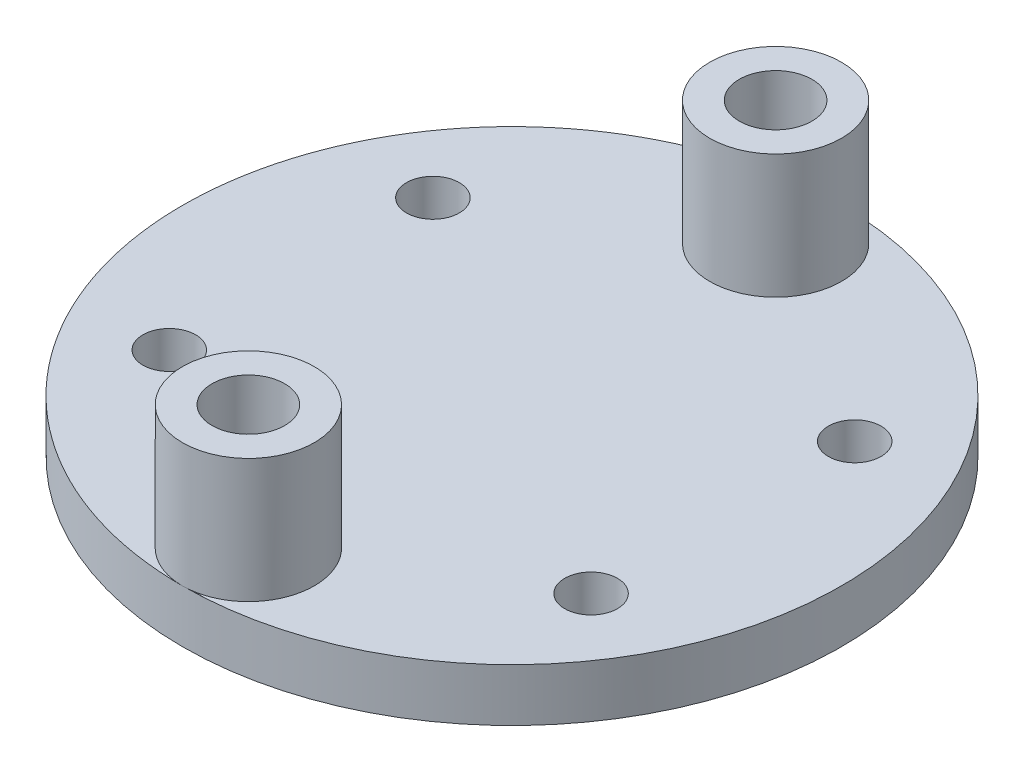
ISO-10303-21;
HEADER;
FILE_DESCRIPTION(('STEP AP214'),'2;1');
FILE_NAME('part.step','',(''),(''),'','','');
FILE_SCHEMA(('AUTOMOTIVE_DESIGN { 1 0 10303 214 1 1 1 1 }'));
ENDSEC;
DATA;
#1=APPLICATION_CONTEXT('core data for automotive mechanical design processes');
#2=APPLICATION_PROTOCOL_DEFINITION('international standard','automotive_design',2000,#1);
#3=PRODUCT_CONTEXT('',#1,'mechanical');
#4=PRODUCT('Part','Part','',(#3));
#5=PRODUCT_RELATED_PRODUCT_CATEGORY('part','',(#4));
#6=PRODUCT_DEFINITION_FORMATION('','',#4);
#7=PRODUCT_DEFINITION_CONTEXT('part definition',#1,'design');
#8=PRODUCT_DEFINITION('design','',#6,#7);
#9=PRODUCT_DEFINITION_SHAPE('','',#8);
#10=(LENGTH_UNIT() NAMED_UNIT(*) SI_UNIT(.MILLI.,.METRE.));
#11=(NAMED_UNIT(*) PLANE_ANGLE_UNIT() SI_UNIT($,.RADIAN.));
#12=(NAMED_UNIT(*) SI_UNIT($,.STERADIAN.) SOLID_ANGLE_UNIT());
#13=UNCERTAINTY_MEASURE_WITH_UNIT(LENGTH_MEASURE(1.E-05),#10,'distance_accuracy_value','');
#14=(GEOMETRIC_REPRESENTATION_CONTEXT(3) GLOBAL_UNCERTAINTY_ASSIGNED_CONTEXT((#13)) GLOBAL_UNIT_ASSIGNED_CONTEXT((#10,
#11,#12)) REPRESENTATION_CONTEXT('',''));
#15=CARTESIAN_POINT('',(0.,0.,0.));
#16=DIRECTION('',(0.,0.,1.));
#17=DIRECTION('',(1.,0.,0.));
#18=AXIS2_PLACEMENT_3D('',#15,#16,#17);
#19=CARTESIAN_POINT('',(12.7,2.54,-21.59));
#20=DIRECTION('',(0.,-1.,0.));
#21=DIRECTION('',(0.,0.,-1.));
#22=AXIS2_PLACEMENT_3D('',#19,#20,#21);
#23=CYLINDRICAL_SURFACE('',#22,1.75);
#24=CARTESIAN_POINT('',(12.7,0.,-21.59));
#25=DIRECTION('',(0.,1.,0.));
#26=DIRECTION('',(0.,0.,1.));
#27=AXIS2_PLACEMENT_3D('',#24,#25,#26);
#28=CIRCLE('',#27,1.75);
#29=CARTESIAN_POINT('',(12.7,0.,-19.84));
#30=VERTEX_POINT('',#29);
#31=EDGE_CURVE('E93',#30,#30,#28,.T.);
#32=ORIENTED_EDGE('',*,*,#31,.F.);
#33=EDGE_LOOP('',(#32));
#34=FACE_BOUND('',#33,.T.);
#35=CARTESIAN_POINT('',(12.7,8.514999988,-21.59));
#36=DIRECTION('',(0.,1.,0.));
#37=DIRECTION('',(0.,0.,1.));
#38=AXIS2_PLACEMENT_3D('',#35,#36,#37);
#39=CIRCLE('',#38,1.75);
#40=CARTESIAN_POINT('',(12.7,8.514999988,-19.84));
#41=VERTEX_POINT('',#40);
#42=EDGE_CURVE('E189',#41,#41,#39,.F.);
#43=ORIENTED_EDGE('',*,*,#42,.F.);
#44=EDGE_LOOP('',(#43));
#45=FACE_BOUND('',#44,.T.);
#46=ADVANCED_FACE('F42',(#34,#45),#23,.F.);
#47=CARTESIAN_POINT('',(12.7,2.54,-8.89));
#48=DIRECTION('',(0.,-1.,0.));
#49=DIRECTION('',(0.,0.,-1.));
#50=AXIS2_PLACEMENT_3D('',#47,#48,#49);
#51=CYLINDRICAL_SURFACE('',#50,15.875);
#52=CARTESIAN_POINT('',(12.7,2.54,-8.89));
#53=DIRECTION('',(0.,1.,0.));
#54=DIRECTION('',(0.,0.,1.));
#55=AXIS2_PLACEMENT_3D('',#52,#53,#54);
#56=CIRCLE('',#55,15.875);
#57=CARTESIAN_POINT('',(12.7,2.54,6.985));
#58=VERTEX_POINT('',#57);
#59=CARTESIAN_POINT('',(12.7,2.54,-24.765));
#60=VERTEX_POINT('',#59);
#61=EDGE_CURVE('E11',#58,#60,#56,.T.);
#62=ORIENTED_EDGE('',*,*,#61,.F.);
#63=EDGE_CURVE('E52',#60,#58,#56,.T.);
#64=ORIENTED_EDGE('',*,*,#63,.F.);
#65=EDGE_LOOP('',(#62,#64));
#66=FACE_BOUND('',#65,.T.);
#67=CARTESIAN_POINT('',(12.7,0.,-8.89));
#68=DIRECTION('',(0.,1.,0.));
#69=DIRECTION('',(0.,0.,1.));
#70=AXIS2_PLACEMENT_3D('',#67,#68,#69);
#71=CIRCLE('',#70,15.875);
#72=CARTESIAN_POINT('',(12.7,0.,6.985));
#73=VERTEX_POINT('',#72);
#74=EDGE_CURVE('E90',#73,#73,#71,.T.);
#75=ORIENTED_EDGE('',*,*,#74,.T.);
#76=EDGE_LOOP('',(#75));
#77=FACE_BOUND('',#76,.T.);
#78=ADVANCED_FACE('F62',(#66,#77),#51,.T.);
#79=CARTESIAN_POINT('',(2.54,2.54,-2.54));
#80=DIRECTION('',(0.,-1.,0.));
#81=DIRECTION('',(0.,0.,-1.));
#82=AXIS2_PLACEMENT_3D('',#79,#80,#81);
#83=CYLINDRICAL_SURFACE('',#82,1.27);
#84=CARTESIAN_POINT('',(2.54,2.54,-2.54));
#85=DIRECTION('',(0.,1.,0.));
#86=DIRECTION('',(0.,0.,1.));
#87=AXIS2_PLACEMENT_3D('',#84,#85,#86);
#88=CIRCLE('',#87,1.27);
#89=CARTESIAN_POINT('',(2.54,2.54,-1.27));
#90=VERTEX_POINT('',#89);
#91=EDGE_CURVE('E69',#90,#90,#88,.F.);
#92=ORIENTED_EDGE('',*,*,#91,.F.);
#93=EDGE_LOOP('',(#92));
#94=FACE_BOUND('',#93,.T.);
#95=CARTESIAN_POINT('',(2.54,0.,-2.54));
#96=DIRECTION('',(0.,1.,0.));
#97=DIRECTION('',(0.,0.,1.));
#98=AXIS2_PLACEMENT_3D('',#95,#96,#97);
#99=CIRCLE('',#98,1.27);
#100=CARTESIAN_POINT('',(2.54,0.,-1.27));
#101=VERTEX_POINT('',#100);
#102=EDGE_CURVE('E88',#101,#101,#99,.F.);
#103=ORIENTED_EDGE('',*,*,#102,.T.);
#104=EDGE_LOOP('',(#103));
#105=FACE_BOUND('',#104,.T.);
#106=ADVANCED_FACE('F121',(#94,#105),#83,.F.);
#107=CARTESIAN_POINT('',(22.86,2.54,-2.54));
#108=DIRECTION('',(0.,-1.,0.));
#109=DIRECTION('',(0.,0.,-1.));
#110=AXIS2_PLACEMENT_3D('',#107,#108,#109);
#111=CYLINDRICAL_SURFACE('',#110,1.27);
#112=CARTESIAN_POINT('',(22.86,2.54,-2.54));
#113=DIRECTION('',(0.,1.,0.));
#114=DIRECTION('',(0.,0.,1.));
#115=AXIS2_PLACEMENT_3D('',#112,#113,#114);
#116=CIRCLE('',#115,1.27);
#117=CARTESIAN_POINT('',(22.86,2.54,-1.27));
#118=VERTEX_POINT('',#117);
#119=EDGE_CURVE('E75',#118,#118,#116,.T.);
#120=ORIENTED_EDGE('',*,*,#119,.T.);
#121=EDGE_LOOP('',(#120));
#122=FACE_BOUND('',#121,.T.);
#123=CARTESIAN_POINT('',(22.86,0.,-2.54));
#124=DIRECTION('',(0.,1.,0.));
#125=DIRECTION('',(0.,0.,1.));
#126=AXIS2_PLACEMENT_3D('',#123,#124,#125);
#127=CIRCLE('',#126,1.27);
#128=CARTESIAN_POINT('',(22.86,0.,-1.27));
#129=VERTEX_POINT('',#128);
#130=EDGE_CURVE('E83',#129,#129,#127,.T.);
#131=ORIENTED_EDGE('',*,*,#130,.F.);
#132=EDGE_LOOP('',(#131));
#133=FACE_BOUND('',#132,.T.);
#134=ADVANCED_FACE('F112',(#122,#133),#111,.F.);
#135=CARTESIAN_POINT('',(2.54,2.54,-15.24));
#136=DIRECTION('',(0.,-1.,0.));
#137=DIRECTION('',(0.,0.,-1.));
#138=AXIS2_PLACEMENT_3D('',#135,#136,#137);
#139=CYLINDRICAL_SURFACE('',#138,1.27);
#140=CARTESIAN_POINT('',(2.54,2.54,-15.24));
#141=DIRECTION('',(0.,1.,0.));
#142=DIRECTION('',(0.,0.,1.));
#143=AXIS2_PLACEMENT_3D('',#140,#141,#142);
#144=CIRCLE('',#143,1.27);
#145=CARTESIAN_POINT('',(2.54,2.54,-13.97));
#146=VERTEX_POINT('',#145);
#147=EDGE_CURVE('E99',#146,#146,#144,.T.);
#148=ORIENTED_EDGE('',*,*,#147,.T.);
#149=EDGE_LOOP('',(#148));
#150=FACE_BOUND('',#149,.T.);
#151=CARTESIAN_POINT('',(2.54,0.,-15.24));
#152=DIRECTION('',(0.,1.,0.));
#153=DIRECTION('',(0.,0.,1.));
#154=AXIS2_PLACEMENT_3D('',#151,#152,#153);
#155=CIRCLE('',#154,1.27);
#156=CARTESIAN_POINT('',(2.54,0.,-13.97));
#157=VERTEX_POINT('',#156);
#158=EDGE_CURVE('E78',#157,#157,#155,.T.);
#159=ORIENTED_EDGE('',*,*,#158,.F.);
#160=EDGE_LOOP('',(#159));
#161=FACE_BOUND('',#160,.T.);
#162=ADVANCED_FACE('F144',(#150,#161),#139,.F.);
#163=CARTESIAN_POINT('',(22.86,2.54,-15.24));
#164=DIRECTION('',(0.,-1.,0.));
#165=DIRECTION('',(0.,0.,-1.));
#166=AXIS2_PLACEMENT_3D('',#163,#164,#165);
#167=CYLINDRICAL_SURFACE('',#166,1.27);
#168=CARTESIAN_POINT('',(22.86,2.54,-15.24));
#169=DIRECTION('',(0.,1.,0.));
#170=DIRECTION('',(0.,0.,1.));
#171=AXIS2_PLACEMENT_3D('',#168,#169,#170);
#172=CIRCLE('',#171,1.27);
#173=CARTESIAN_POINT('',(22.86,2.54,-13.97));
#174=VERTEX_POINT('',#173);
#175=EDGE_CURVE('E96',#174,#174,#172,.F.);
#176=ORIENTED_EDGE('',*,*,#175,.F.);
#177=EDGE_LOOP('',(#176));
#178=FACE_BOUND('',#177,.T.);
#179=CARTESIAN_POINT('',(22.86,0.,-15.24));
#180=DIRECTION('',(0.,1.,0.));
#181=DIRECTION('',(0.,0.,1.));
#182=AXIS2_PLACEMENT_3D('',#179,#180,#181);
#183=CIRCLE('',#182,1.27);
#184=CARTESIAN_POINT('',(22.86,0.,-13.97));
#185=VERTEX_POINT('',#184);
#186=EDGE_CURVE('E79',#185,#185,#183,.F.);
#187=ORIENTED_EDGE('',*,*,#186,.T.);
#188=EDGE_LOOP('',(#187));
#189=FACE_BOUND('',#188,.T.);
#190=ADVANCED_FACE('F46',(#178,#189),#167,.F.);
#191=CARTESIAN_POINT('',(12.7,2.54,3.81));
#192=DIRECTION('',(0.,-1.,0.));
#193=DIRECTION('',(0.,0.,-1.));
#194=AXIS2_PLACEMENT_3D('',#191,#192,#193);
#195=CYLINDRICAL_SURFACE('',#194,1.75);
#196=CARTESIAN_POINT('',(12.7,0.,3.81));
#197=DIRECTION('',(0.,1.,0.));
#198=DIRECTION('',(0.,0.,1.));
#199=AXIS2_PLACEMENT_3D('',#196,#197,#198);
#200=CIRCLE('',#199,1.75);
#201=CARTESIAN_POINT('',(12.7,0.,5.56));
#202=VERTEX_POINT('',#201);
#203=EDGE_CURVE('E48',#202,#202,#200,.F.);
#204=ORIENTED_EDGE('',*,*,#203,.T.);
#205=EDGE_LOOP('',(#204));
#206=FACE_BOUND('',#205,.T.);
#207=CARTESIAN_POINT('',(12.7,8.514999988,3.81));
#208=DIRECTION('',(0.,1.,0.));
#209=DIRECTION('',(0.,0.,1.));
#210=AXIS2_PLACEMENT_3D('',#207,#208,#209);
#211=CIRCLE('',#210,1.75);
#212=CARTESIAN_POINT('',(12.7,8.514999988,5.56));
#213=VERTEX_POINT('',#212);
#214=EDGE_CURVE('E194',#213,#213,#211,.F.);
#215=ORIENTED_EDGE('',*,*,#214,.F.);
#216=EDGE_LOOP('',(#215));
#217=FACE_BOUND('',#216,.T.);
#218=ADVANCED_FACE('F120',(#206,#217),#195,.F.);
#219=CARTESIAN_POINT('',(0.,2.54,0.));
#220=DIRECTION('',(0.,1.,0.));
#221=DIRECTION('',(0.,0.,1.));
#222=AXIS2_PLACEMENT_3D('',#219,#220,#221);
#223=PLANE('',#222);
#224=ORIENTED_EDGE('',*,*,#175,.T.);
#225=EDGE_LOOP('',(#224));
#226=FACE_BOUND('',#225,.T.);
#227=ORIENTED_EDGE('',*,*,#147,.F.);
#228=EDGE_LOOP('',(#227));
#229=FACE_BOUND('',#228,.T.);
#230=ORIENTED_EDGE('',*,*,#119,.F.);
#231=EDGE_LOOP('',(#230));
#232=FACE_BOUND('',#231,.T.);
#233=ORIENTED_EDGE('',*,*,#91,.T.);
#234=EDGE_LOOP('',(#233));
#235=FACE_BOUND('',#234,.T.);
#236=ORIENTED_EDGE('',*,*,#61,.T.);
#237=CARTESIAN_POINT('',(12.7,2.54,-21.59));
#238=DIRECTION('',(0.,1.,0.));
#239=DIRECTION('',(0.,0.,1.));
#240=AXIS2_PLACEMENT_3D('',#237,#238,#239);
#241=CIRCLE('',#240,3.175);
#242=EDGE_CURVE('E67',#60,#60,#241,.T.);
#243=ORIENTED_EDGE('',*,*,#242,.F.);
#244=ORIENTED_EDGE('',*,*,#63,.T.);
#245=CARTESIAN_POINT('',(12.7,2.54,3.81));
#246=DIRECTION('',(0.,1.,0.));
#247=DIRECTION('',(0.,0.,1.));
#248=AXIS2_PLACEMENT_3D('',#245,#246,#247);
#249=CIRCLE('',#248,3.175);
#250=EDGE_CURVE('E70',#58,#58,#249,.T.);
#251=ORIENTED_EDGE('',*,*,#250,.F.);
#252=EDGE_LOOP('',(#236,#243,#244,#251));
#253=FACE_BOUND('',#252,.T.);
#254=ADVANCED_FACE('F64',(#226,#229,#232,#235,#253),#223,.T.);
#255=CARTESIAN_POINT('',(0.,0.,0.));
#256=DIRECTION('',(0.,1.,0.));
#257=DIRECTION('',(0.,0.,1.));
#258=AXIS2_PLACEMENT_3D('',#255,#256,#257);
#259=PLANE('',#258);
#260=ORIENTED_EDGE('',*,*,#186,.F.);
#261=EDGE_LOOP('',(#260));
#262=FACE_BOUND('',#261,.T.);
#263=ORIENTED_EDGE('',*,*,#158,.T.);
#264=EDGE_LOOP('',(#263));
#265=FACE_BOUND('',#264,.T.);
#266=ORIENTED_EDGE('',*,*,#130,.T.);
#267=EDGE_LOOP('',(#266));
#268=FACE_BOUND('',#267,.T.);
#269=ORIENTED_EDGE('',*,*,#102,.F.);
#270=EDGE_LOOP('',(#269));
#271=FACE_BOUND('',#270,.T.);
#272=ORIENTED_EDGE('',*,*,#74,.F.);
#273=EDGE_LOOP('',(#272));
#274=FACE_BOUND('',#273,.T.);
#275=ORIENTED_EDGE('',*,*,#31,.T.);
#276=EDGE_LOOP('',(#275));
#277=FACE_BOUND('',#276,.T.);
#278=ORIENTED_EDGE('',*,*,#203,.F.);
#279=EDGE_LOOP('',(#278));
#280=FACE_BOUND('',#279,.T.);
#281=ADVANCED_FACE('F116',(#262,#265,#268,#271,#274,#277,#280),#259,.F.);
#282=CARTESIAN_POINT('',(12.7,8.514999988,3.81));
#283=DIRECTION('',(0.,-1.,0.));
#284=DIRECTION('',(0.,0.,-1.));
#285=AXIS2_PLACEMENT_3D('',#282,#283,#284);
#286=CYLINDRICAL_SURFACE('',#285,3.175);
#287=CARTESIAN_POINT('',(12.7,8.514999988,3.81));
#288=DIRECTION('',(0.,1.,0.));
#289=DIRECTION('',(0.,0.,1.));
#290=AXIS2_PLACEMENT_3D('',#287,#288,#289);
#291=CIRCLE('',#290,3.175);
#292=CARTESIAN_POINT('',(12.7,8.514999988,6.985));
#293=VERTEX_POINT('',#292);
#294=EDGE_CURVE('E193',#293,#293,#291,.T.);
#295=ORIENTED_EDGE('',*,*,#294,.F.);
#296=EDGE_LOOP('',(#295));
#297=FACE_BOUND('',#296,.T.);
#298=ORIENTED_EDGE('',*,*,#250,.T.);
#299=EDGE_LOOP('',(#298));
#300=FACE_BOUND('',#299,.T.);
#301=ADVANCED_FACE('F129',(#297,#300),#286,.T.);
#302=CARTESIAN_POINT('',(0.,8.514999988,0.));
#303=DIRECTION('',(0.,1.,0.));
#304=DIRECTION('',(0.,0.,1.));
#305=AXIS2_PLACEMENT_3D('',#302,#303,#304);
#306=PLANE('',#305);
#307=ORIENTED_EDGE('',*,*,#214,.T.);
#308=EDGE_LOOP('',(#307));
#309=FACE_BOUND('',#308,.T.);
#310=ORIENTED_EDGE('',*,*,#294,.T.);
#311=EDGE_LOOP('',(#310));
#312=FACE_BOUND('',#311,.T.);
#313=ADVANCED_FACE('F166',(#309,#312),#306,.T.);
#314=CARTESIAN_POINT('',(12.7,8.514999988,-21.59));
#315=DIRECTION('',(0.,-1.,0.));
#316=DIRECTION('',(0.,0.,-1.));
#317=AXIS2_PLACEMENT_3D('',#314,#315,#316);
#318=CYLINDRICAL_SURFACE('',#317,3.175);
#319=CARTESIAN_POINT('',(12.7,8.514999988,-21.59));
#320=DIRECTION('',(0.,1.,0.));
#321=DIRECTION('',(0.,0.,1.));
#322=AXIS2_PLACEMENT_3D('',#319,#320,#321);
#323=CIRCLE('',#322,3.175);
#324=CARTESIAN_POINT('',(12.7,8.514999988,-18.415));
#325=VERTEX_POINT('',#324);
#326=EDGE_CURVE('E77',#325,#325,#323,.T.);
#327=ORIENTED_EDGE('',*,*,#326,.F.);
#328=EDGE_LOOP('',(#327));
#329=FACE_BOUND('',#328,.T.);
#330=ORIENTED_EDGE('',*,*,#242,.T.);
#331=EDGE_LOOP('',(#330));
#332=FACE_BOUND('',#331,.T.);
#333=ADVANCED_FACE('F172',(#329,#332),#318,.T.);
#334=CARTESIAN_POINT('',(0.,8.514999988,0.));
#335=DIRECTION('',(0.,1.,0.));
#336=DIRECTION('',(0.,0.,1.));
#337=AXIS2_PLACEMENT_3D('',#334,#335,#336);
#338=PLANE('',#337);
#339=ORIENTED_EDGE('',*,*,#42,.T.);
#340=EDGE_LOOP('',(#339));
#341=FACE_BOUND('',#340,.T.);
#342=ORIENTED_EDGE('',*,*,#326,.T.);
#343=EDGE_LOOP('',(#342));
#344=FACE_BOUND('',#343,.T.);
#345=ADVANCED_FACE('F180',(#341,#344),#338,.T.);
#346=CLOSED_SHELL('',(#46,#78,#106,#134,#162,#190,#218,#254,#281,#301,#313,#333,#345));
#347=MANIFOLD_SOLID_BREP('B2',#346);
#348=ADVANCED_BREP_SHAPE_REPRESENTATION('',(#18,#347),#14);
#349=SHAPE_DEFINITION_REPRESENTATION(#9,#348);
ENDSEC;
END-ISO-10303-21;
